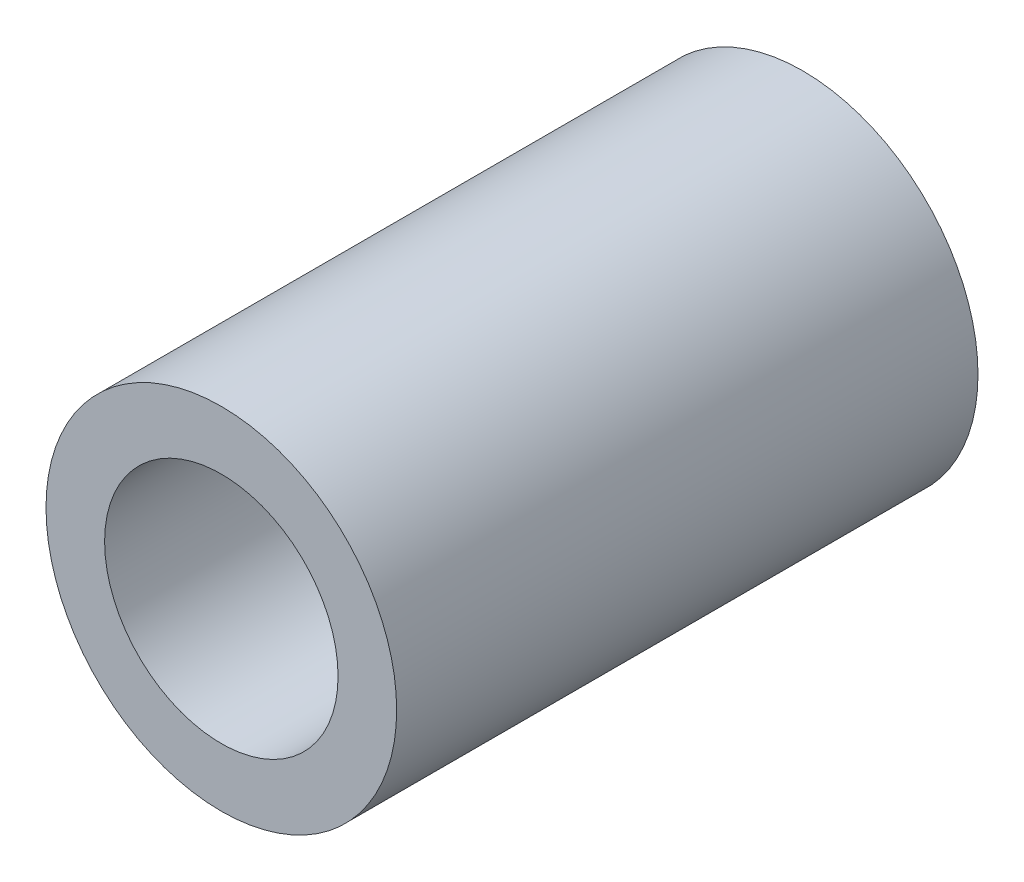
ISO-10303-21;
HEADER;
FILE_DESCRIPTION(('STEP AP214'),'2;1');
FILE_NAME('part.step','',(''),(''),'','','');
FILE_SCHEMA(('AUTOMOTIVE_DESIGN { 1 0 10303 214 1 1 1 1 }'));
ENDSEC;
DATA;
#1=APPLICATION_CONTEXT('core data for automotive mechanical design processes');
#2=APPLICATION_PROTOCOL_DEFINITION('international standard','automotive_design',2000,#1);
#3=PRODUCT_CONTEXT('',#1,'mechanical');
#4=PRODUCT('Part','Part','',(#3));
#5=PRODUCT_RELATED_PRODUCT_CATEGORY('part','',(#4));
#6=PRODUCT_DEFINITION_FORMATION('','',#4);
#7=PRODUCT_DEFINITION_CONTEXT('part definition',#1,'design');
#8=PRODUCT_DEFINITION('design','',#6,#7);
#9=PRODUCT_DEFINITION_SHAPE('','',#8);
#10=(LENGTH_UNIT() NAMED_UNIT(*) SI_UNIT(.MILLI.,.METRE.));
#11=(NAMED_UNIT(*) PLANE_ANGLE_UNIT() SI_UNIT($,.RADIAN.));
#12=(NAMED_UNIT(*) SI_UNIT($,.STERADIAN.) SOLID_ANGLE_UNIT());
#13=UNCERTAINTY_MEASURE_WITH_UNIT(LENGTH_MEASURE(1.E-05),#10,'distance_accuracy_value','');
#14=(GEOMETRIC_REPRESENTATION_CONTEXT(3) GLOBAL_UNCERTAINTY_ASSIGNED_CONTEXT((#13)) GLOBAL_UNIT_ASSIGNED_CONTEXT((#10,
#11,#12)) REPRESENTATION_CONTEXT('',''));
#15=CARTESIAN_POINT('',(0.,0.,0.));
#16=DIRECTION('',(0.,0.,1.));
#17=DIRECTION('',(1.,0.,0.));
#18=AXIS2_PLACEMENT_3D('',#15,#16,#17);
#19=CARTESIAN_POINT('',(0.,0.,7.9375));
#20=DIRECTION('',(0.,0.,1.));
#21=DIRECTION('',(1.,0.,0.));
#22=AXIS2_PLACEMENT_3D('',#19,#20,#21);
#23=PLANE('',#22);
#24=CARTESIAN_POINT('',(0.,0.,7.9375));
#25=DIRECTION('',(0.,0.,1.));
#26=DIRECTION('',(1.,0.,0.));
#27=AXIS2_PLACEMENT_3D('',#24,#25,#26);
#28=CIRCLE('',#27,4.7879);
#29=CARTESIAN_POINT('',(4.7879,0.,7.9375));
#30=VERTEX_POINT('',#29);
#31=EDGE_CURVE('E10',#30,#30,#28,.T.);
#32=ORIENTED_EDGE('',*,*,#31,.T.);
#33=EDGE_LOOP('',(#32));
#34=FACE_BOUND('',#33,.T.);
#35=CARTESIAN_POINT('',(0.,0.,7.9375));
#36=DIRECTION('',(0.,0.,1.));
#37=DIRECTION('',(1.,0.,0.));
#38=AXIS2_PLACEMENT_3D('',#35,#36,#37);
#39=CIRCLE('',#38,3.1877);
#40=CARTESIAN_POINT('',(3.1877,0.,7.9375));
#41=VERTEX_POINT('',#40);
#42=EDGE_CURVE('E41',#41,#41,#39,.T.);
#43=ORIENTED_EDGE('',*,*,#42,.F.);
#44=EDGE_LOOP('',(#43));
#45=FACE_BOUND('',#44,.T.);
#46=ADVANCED_FACE('F30',(#34,#45),#23,.T.);
#47=CARTESIAN_POINT('',(0.,0.,-7.9375));
#48=DIRECTION('',(0.,0.,1.));
#49=DIRECTION('',(1.,0.,0.));
#50=AXIS2_PLACEMENT_3D('',#47,#48,#49);
#51=PLANE('',#50);
#52=CARTESIAN_POINT('',(0.,0.,-7.9375));
#53=DIRECTION('',(0.,0.,1.));
#54=DIRECTION('',(1.,0.,0.));
#55=AXIS2_PLACEMENT_3D('',#52,#53,#54);
#56=CIRCLE('',#55,4.7879);
#57=CARTESIAN_POINT('',(4.7879,0.,-7.9375));
#58=VERTEX_POINT('',#57);
#59=EDGE_CURVE('E34',#58,#58,#56,.T.);
#60=ORIENTED_EDGE('',*,*,#59,.F.);
#61=EDGE_LOOP('',(#60));
#62=FACE_BOUND('',#61,.T.);
#63=CARTESIAN_POINT('',(0.,0.,-7.9375));
#64=DIRECTION('',(0.,0.,1.));
#65=DIRECTION('',(1.,0.,0.));
#66=AXIS2_PLACEMENT_3D('',#63,#64,#65);
#67=CIRCLE('',#66,3.1877);
#68=CARTESIAN_POINT('',(3.1877,0.,-7.9375));
#69=VERTEX_POINT('',#68);
#70=EDGE_CURVE('E43',#69,#69,#67,.T.);
#71=ORIENTED_EDGE('',*,*,#70,.T.);
#72=EDGE_LOOP('',(#71));
#73=FACE_BOUND('',#72,.T.);
#74=ADVANCED_FACE('F53',(#62,#73),#51,.F.);
#75=CARTESIAN_POINT('',(0.,0.,7.9375));
#76=DIRECTION('',(0.,0.,-1.));
#77=DIRECTION('',(-1.,0.,0.));
#78=AXIS2_PLACEMENT_3D('',#75,#76,#77);
#79=CYLINDRICAL_SURFACE('',#78,4.7879);
#80=ORIENTED_EDGE('',*,*,#31,.F.);
#81=EDGE_LOOP('',(#80));
#82=FACE_BOUND('',#81,.T.);
#83=ORIENTED_EDGE('',*,*,#59,.T.);
#84=EDGE_LOOP('',(#83));
#85=FACE_BOUND('',#84,.T.);
#86=ADVANCED_FACE('F32',(#82,#85),#79,.T.);
#87=CARTESIAN_POINT('',(0.,0.,7.9375));
#88=DIRECTION('',(0.,0.,-1.));
#89=DIRECTION('',(-1.,0.,0.));
#90=AXIS2_PLACEMENT_3D('',#87,#88,#89);
#91=CYLINDRICAL_SURFACE('',#90,3.1877);
#92=ORIENTED_EDGE('',*,*,#42,.T.);
#93=EDGE_LOOP('',(#92));
#94=FACE_BOUND('',#93,.T.);
#95=ORIENTED_EDGE('',*,*,#70,.F.);
#96=EDGE_LOOP('',(#95));
#97=FACE_BOUND('',#96,.T.);
#98=ADVANCED_FACE('F49',(#94,#97),#91,.F.);
#99=CLOSED_SHELL('',(#46,#74,#86,#98));
#100=MANIFOLD_SOLID_BREP('B2',#99);
#101=ADVANCED_BREP_SHAPE_REPRESENTATION('',(#18,#100),#14);
#102=SHAPE_DEFINITION_REPRESENTATION(#9,#101);
ENDSEC;
END-ISO-10303-21;
